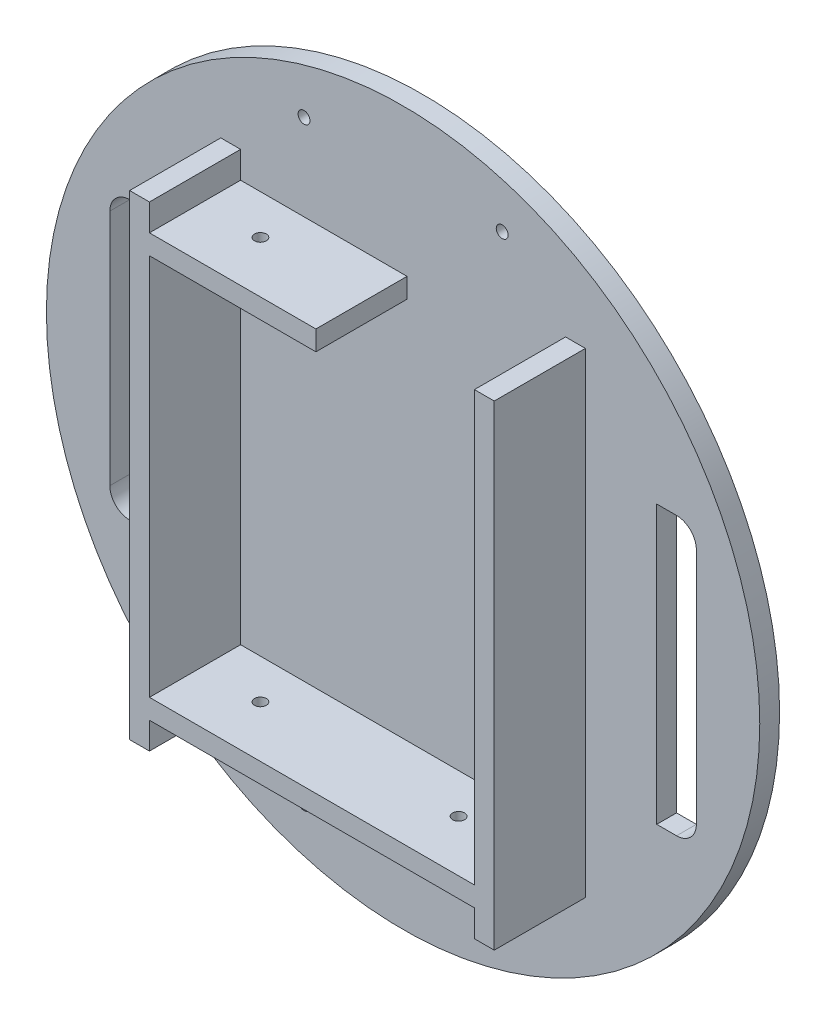
ISO-10303-21;
HEADER;
FILE_DESCRIPTION(('STEP AP214'),'2;1');
FILE_NAME('part.step','',(''),(''),'','','');
FILE_SCHEMA(('AUTOMOTIVE_DESIGN { 1 0 10303 214 1 1 1 1 }'));
ENDSEC;
DATA;
#1=APPLICATION_CONTEXT('core data for automotive mechanical design processes');
#2=APPLICATION_PROTOCOL_DEFINITION('international standard','automotive_design',2000,#1);
#3=PRODUCT_CONTEXT('',#1,'mechanical');
#4=PRODUCT('Part','Part','',(#3));
#5=PRODUCT_RELATED_PRODUCT_CATEGORY('part','',(#4));
#6=PRODUCT_DEFINITION_FORMATION('','',#4);
#7=PRODUCT_DEFINITION_CONTEXT('part definition',#1,'design');
#8=PRODUCT_DEFINITION('design','',#6,#7);
#9=PRODUCT_DEFINITION_SHAPE('','',#8);
#10=(LENGTH_UNIT() NAMED_UNIT(*) SI_UNIT(.MILLI.,.METRE.));
#11=(NAMED_UNIT(*) PLANE_ANGLE_UNIT() SI_UNIT($,.RADIAN.));
#12=(NAMED_UNIT(*) SI_UNIT($,.STERADIAN.) SOLID_ANGLE_UNIT());
#13=UNCERTAINTY_MEASURE_WITH_UNIT(LENGTH_MEASURE(1.E-05),#10,'distance_accuracy_value','');
#14=(GEOMETRIC_REPRESENTATION_CONTEXT(3) GLOBAL_UNCERTAINTY_ASSIGNED_CONTEXT((#13)) GLOBAL_UNIT_ASSIGNED_CONTEXT((#10,
#11,#12)) REPRESENTATION_CONTEXT('',''));
#15=CARTESIAN_POINT('',(0.,0.,0.));
#16=DIRECTION('',(0.,0.,1.));
#17=DIRECTION('',(1.,0.,0.));
#18=AXIS2_PLACEMENT_3D('',#15,#16,#17);
#19=CARTESIAN_POINT('',(0.,0.,5.));
#20=DIRECTION('',(0.,0.,1.));
#21=DIRECTION('',(1.,0.,0.));
#22=AXIS2_PLACEMENT_3D('',#19,#20,#21);
#23=PLANE('',#22);
#24=DIRECTION('',(0.,-1.,0.));
#25=VECTOR('',#24,1.);
#26=CARTESIAN_POINT('',(64.,35.,5.));
#27=LINE('',#26,#25);
#28=CARTESIAN_POINT('',(64.,35.,5.));
#29=VERTEX_POINT('',#28);
#30=CARTESIAN_POINT('',(64.,-35.,5.));
#31=VERTEX_POINT('',#30);
#32=EDGE_CURVE('E383',#29,#31,#27,.T.);
#33=ORIENTED_EDGE('',*,*,#32,.F.);
#34=DIRECTION('',(1.,0.,0.));
#35=VECTOR('',#34,1.);
#36=CARTESIAN_POINT('',(64.,35.,5.));
#37=LINE('',#36,#35);
#38=CARTESIAN_POINT('',(69.,35.,5.));
#39=VERTEX_POINT('',#38);
#40=EDGE_CURVE('E399',#29,#39,#37,.T.);
#41=ORIENTED_EDGE('',*,*,#40,.T.);
#42=CARTESIAN_POINT('',(69.,30.,5.));
#43=DIRECTION('',(0.,0.,-1.));
#44=DIRECTION('',(-1.,0.,0.));
#45=AXIS2_PLACEMENT_3D('',#42,#43,#44);
#46=CIRCLE('',#45,5.);
#47=CARTESIAN_POINT('',(74.,30.,5.));
#48=VERTEX_POINT('',#47);
#49=EDGE_CURVE('E396',#39,#48,#46,.T.);
#50=ORIENTED_EDGE('',*,*,#49,.T.);
#51=DIRECTION('',(0.,-1.,0.));
#52=VECTOR('',#51,1.);
#53=CARTESIAN_POINT('',(74.,30.,5.));
#54=LINE('',#53,#52);
#55=CARTESIAN_POINT('',(74.,-30.,5.));
#56=VERTEX_POINT('',#55);
#57=EDGE_CURVE('E393',#48,#56,#54,.T.);
#58=ORIENTED_EDGE('',*,*,#57,.T.);
#59=CARTESIAN_POINT('',(69.,-30.,5.));
#60=DIRECTION('',(0.,0.,1.));
#61=DIRECTION('',(1.,0.,0.));
#62=AXIS2_PLACEMENT_3D('',#59,#60,#61);
#63=CIRCLE('',#62,5.);
#64=CARTESIAN_POINT('',(69.,-35.,5.));
#65=VERTEX_POINT('',#64);
#66=EDGE_CURVE('E390',#65,#56,#63,.T.);
#67=ORIENTED_EDGE('',*,*,#66,.F.);
#68=DIRECTION('',(1.,0.,0.));
#69=VECTOR('',#68,1.);
#70=CARTESIAN_POINT('',(64.,-35.,5.));
#71=LINE('',#70,#69);
#72=EDGE_CURVE('E386',#31,#65,#71,.T.);
#73=ORIENTED_EDGE('',*,*,#72,.F.);
#74=EDGE_LOOP('',(#33,#41,#50,#58,#67,#73));
#75=FACE_BOUND('',#74,.T.);
#76=CARTESIAN_POINT('',(0.,0.,5.));
#77=DIRECTION('',(0.,0.,1.));
#78=DIRECTION('',(1.,0.,0.));
#79=AXIS2_PLACEMENT_3D('',#76,#77,#78);
#80=CIRCLE('',#79,90.);
#81=CARTESIAN_POINT('',(90.,0.,5.));
#82=VERTEX_POINT('',#81);
#83=EDGE_CURVE('E11',#82,#82,#80,.T.);
#84=ORIENTED_EDGE('',*,*,#83,.T.);
#85=EDGE_LOOP('',(#84));
#86=FACE_BOUND('',#85,.T.);
#87=DIRECTION('',(-1.,0.,0.));
#88=VECTOR('',#87,1.);
#89=CARTESIAN_POINT('',(0.,-35.,5.));
#90=LINE('',#89,#88);
#91=CARTESIAN_POINT('',(-64.,-35.,5.));
#92=VERTEX_POINT('',#91);
#93=CARTESIAN_POINT('',(-69.,-35.,5.));
#94=VERTEX_POINT('',#93);
#95=EDGE_CURVE('E436',#92,#94,#90,.T.);
#96=ORIENTED_EDGE('',*,*,#95,.T.);
#97=CARTESIAN_POINT('',(-69.,-30.,5.));
#98=DIRECTION('',(0.,0.,1.));
#99=DIRECTION('',(1.,0.,0.));
#100=AXIS2_PLACEMENT_3D('',#97,#98,#99);
#101=CIRCLE('',#100,5.);
#102=CARTESIAN_POINT('',(-74.,-30.,5.));
#103=VERTEX_POINT('',#102);
#104=EDGE_CURVE('E402',#94,#103,#101,.F.);
#105=ORIENTED_EDGE('',*,*,#104,.T.);
#106=DIRECTION('',(0.,-1.,0.));
#107=VECTOR('',#106,1.);
#108=CARTESIAN_POINT('',(-74.,0.,5.));
#109=LINE('',#108,#107);
#110=CARTESIAN_POINT('',(-74.,30.,5.));
#111=VERTEX_POINT('',#110);
#112=EDGE_CURVE('E419',#111,#103,#109,.T.);
#113=ORIENTED_EDGE('',*,*,#112,.F.);
#114=CARTESIAN_POINT('',(-69.,30.,5.));
#115=DIRECTION('',(0.,0.,1.));
#116=DIRECTION('',(1.,0.,0.));
#117=AXIS2_PLACEMENT_3D('',#114,#115,#116);
#118=CIRCLE('',#117,5.);
#119=CARTESIAN_POINT('',(-69.,35.,5.));
#120=VERTEX_POINT('',#119);
#121=EDGE_CURVE('E445',#120,#111,#118,.T.);
#122=ORIENTED_EDGE('',*,*,#121,.F.);
#123=DIRECTION('',(-1.,0.,0.));
#124=VECTOR('',#123,1.);
#125=CARTESIAN_POINT('',(0.,35.,5.));
#126=LINE('',#125,#124);
#127=CARTESIAN_POINT('',(-64.,35.,5.));
#128=VERTEX_POINT('',#127);
#129=EDGE_CURVE('E442',#128,#120,#126,.T.);
#130=ORIENTED_EDGE('',*,*,#129,.F.);
#131=DIRECTION('',(0.,-1.,0.));
#132=VECTOR('',#131,1.);
#133=CARTESIAN_POINT('',(-64.,0.,5.));
#134=LINE('',#133,#132);
#135=EDGE_CURVE('E439',#128,#92,#134,.T.);
#136=ORIENTED_EDGE('',*,*,#135,.T.);
#137=EDGE_LOOP('',(#96,#105,#113,#122,#130,#136));
#138=FACE_BOUND('',#137,.T.);
#139=CARTESIAN_POINT('',(-25.,75.,5.));
#140=DIRECTION('',(0.,0.,1.));
#141=DIRECTION('',(1.,0.,0.));
#142=AXIS2_PLACEMENT_3D('',#139,#140,#141);
#143=CIRCLE('',#142,1.5);
#144=CARTESIAN_POINT('',(-23.5,75.,5.));
#145=VERTEX_POINT('',#144);
#146=EDGE_CURVE('E360',#145,#145,#143,.T.);
#147=ORIENTED_EDGE('',*,*,#146,.F.);
#148=EDGE_LOOP('',(#147));
#149=FACE_BOUND('',#148,.T.);
#150=CARTESIAN_POINT('',(-25.,-75.,5.));
#151=DIRECTION('',(0.,0.,1.));
#152=DIRECTION('',(-1.,0.,0.));
#153=AXIS2_PLACEMENT_3D('',#150,#151,#152);
#154=CIRCLE('',#153,1.5);
#155=CARTESIAN_POINT('',(-26.5,-75.,5.));
#156=VERTEX_POINT('',#155);
#157=EDGE_CURVE('E354',#156,#156,#154,.T.);
#158=ORIENTED_EDGE('',*,*,#157,.F.);
#159=EDGE_LOOP('',(#158));
#160=FACE_BOUND('',#159,.T.);
#161=CARTESIAN_POINT('',(25.,75.,5.));
#162=DIRECTION('',(0.,0.,1.));
#163=DIRECTION('',(-1.,0.,0.));
#164=AXIS2_PLACEMENT_3D('',#161,#162,#163);
#165=CIRCLE('',#164,1.5);
#166=CARTESIAN_POINT('',(23.5,75.,5.));
#167=VERTEX_POINT('',#166);
#168=EDGE_CURVE('E348',#167,#167,#165,.T.);
#169=ORIENTED_EDGE('',*,*,#168,.F.);
#170=EDGE_LOOP('',(#169));
#171=FACE_BOUND('',#170,.T.);
#172=CARTESIAN_POINT('',(25.,-75.,5.));
#173=DIRECTION('',(0.,0.,1.));
#174=DIRECTION('',(1.,0.,0.));
#175=AXIS2_PLACEMENT_3D('',#172,#173,#174);
#176=CIRCLE('',#175,1.5);
#177=CARTESIAN_POINT('',(26.5,-75.,5.));
#178=VERTEX_POINT('',#177);
#179=EDGE_CURVE('E344',#178,#178,#176,.T.);
#180=ORIENTED_EDGE('',*,*,#179,.F.);
#181=EDGE_LOOP('',(#180));
#182=FACE_BOUND('',#181,.T.);
#183=DIRECTION('',(0.,1.,0.));
#184=VECTOR('',#183,1.);
#185=CARTESIAN_POINT('',(1.00000000000002,48.25,5.));
#186=LINE('',#185,#184);
#187=CARTESIAN_POINT('',(1.00000000000002,48.25,5.));
#188=VERTEX_POINT('',#187);
#189=CARTESIAN_POINT('',(1.00000000000002,53.25,5.));
#190=VERTEX_POINT('',#189);
#191=EDGE_CURVE('E52',#188,#190,#186,.T.);
#192=ORIENTED_EDGE('',*,*,#191,.F.);
#193=DIRECTION('',(1.,0.,0.));
#194=VECTOR('',#193,1.);
#195=CARTESIAN_POINT('',(-41.,48.25,5.));
#196=LINE('',#195,#194);
#197=CARTESIAN_POINT('',(-41.,48.25,5.));
#198=VERTEX_POINT('',#197);
#199=EDGE_CURVE('E248',#198,#188,#196,.T.);
#200=ORIENTED_EDGE('',*,*,#199,.F.);
#201=DIRECTION('',(0.,-1.,0.));
#202=VECTOR('',#201,1.);
#203=CARTESIAN_POINT('',(-41.,0.,5.));
#204=LINE('',#203,#202);
#205=CARTESIAN_POINT('',(-41.,-48.25,5.));
#206=VERTEX_POINT('',#205);
#207=EDGE_CURVE('E332',#198,#206,#204,.T.);
#208=ORIENTED_EDGE('',*,*,#207,.T.);
#209=DIRECTION('',(-1.,0.,0.));
#210=VECTOR('',#209,1.);
#211=CARTESIAN_POINT('',(-41.,-48.25,5.));
#212=LINE('',#211,#210);
#213=CARTESIAN_POINT('',(41.,-48.25,5.));
#214=VERTEX_POINT('',#213);
#215=EDGE_CURVE('E258',#214,#206,#212,.T.);
#216=ORIENTED_EDGE('',*,*,#215,.F.);
#217=DIRECTION('',(0.,-1.,0.));
#218=VECTOR('',#217,1.);
#219=CARTESIAN_POINT('',(41.,0.,5.));
#220=LINE('',#219,#218);
#221=CARTESIAN_POINT('',(41.,60.,5.));
#222=VERTEX_POINT('',#221);
#223=EDGE_CURVE('E291',#222,#214,#220,.T.);
#224=ORIENTED_EDGE('',*,*,#223,.F.);
#225=DIRECTION('',(1.,0.,0.));
#226=VECTOR('',#225,1.);
#227=CARTESIAN_POINT('',(0.,60.,5.));
#228=LINE('',#227,#226);
#229=CARTESIAN_POINT('',(46.,60.,5.));
#230=VERTEX_POINT('',#229);
#231=EDGE_CURVE('E268',#222,#230,#228,.T.);
#232=ORIENTED_EDGE('',*,*,#231,.T.);
#233=DIRECTION('',(0.,-1.,0.));
#234=VECTOR('',#233,1.);
#235=CARTESIAN_POINT('',(46.,0.,5.));
#236=LINE('',#235,#234);
#237=CARTESIAN_POINT('',(46.,-60.,5.));
#238=VERTEX_POINT('',#237);
#239=EDGE_CURVE('E279',#230,#238,#236,.T.);
#240=ORIENTED_EDGE('',*,*,#239,.T.);
#241=DIRECTION('',(1.,0.,0.));
#242=VECTOR('',#241,1.);
#243=CARTESIAN_POINT('',(0.,-60.,5.));
#244=LINE('',#243,#242);
#245=CARTESIAN_POINT('',(41.,-60.,5.));
#246=VERTEX_POINT('',#245);
#247=EDGE_CURVE('E294',#246,#238,#244,.T.);
#248=ORIENTED_EDGE('',*,*,#247,.F.);
#249=CARTESIAN_POINT('',(41.,-53.25,5.));
#250=VERTEX_POINT('',#249);
#251=EDGE_CURVE('E290',#250,#246,#220,.T.);
#252=ORIENTED_EDGE('',*,*,#251,.F.);
#253=DIRECTION('',(1.,0.,0.));
#254=VECTOR('',#253,1.);
#255=CARTESIAN_POINT('',(-41.,-53.25,5.));
#256=LINE('',#255,#254);
#257=CARTESIAN_POINT('',(-41.,-53.25,5.));
#258=VERTEX_POINT('',#257);
#259=EDGE_CURVE('E263',#258,#250,#256,.T.);
#260=ORIENTED_EDGE('',*,*,#259,.F.);
#261=CARTESIAN_POINT('',(-41.,-60.,5.));
#262=VERTEX_POINT('',#261);
#263=EDGE_CURVE('E330',#258,#262,#204,.T.);
#264=ORIENTED_EDGE('',*,*,#263,.T.);
#265=DIRECTION('',(-1.,0.,0.));
#266=VECTOR('',#265,1.);
#267=CARTESIAN_POINT('',(0.,-60.,5.));
#268=LINE('',#267,#266);
#269=CARTESIAN_POINT('',(-46.,-60.,5.));
#270=VERTEX_POINT('',#269);
#271=EDGE_CURVE('E328',#262,#270,#268,.T.);
#272=ORIENTED_EDGE('',*,*,#271,.T.);
#273=DIRECTION('',(0.,-1.,0.));
#274=VECTOR('',#273,1.);
#275=CARTESIAN_POINT('',(-46.,0.,5.));
#276=LINE('',#275,#274);
#277=CARTESIAN_POINT('',(-46.,60.,5.));
#278=VERTEX_POINT('',#277);
#279=EDGE_CURVE('E325',#278,#270,#276,.T.);
#280=ORIENTED_EDGE('',*,*,#279,.F.);
#281=DIRECTION('',(-1.,0.,0.));
#282=VECTOR('',#281,1.);
#283=CARTESIAN_POINT('',(0.,60.,5.));
#284=LINE('',#283,#282);
#285=CARTESIAN_POINT('',(-41.,60.,5.));
#286=VERTEX_POINT('',#285);
#287=EDGE_CURVE('E309',#286,#278,#284,.T.);
#288=ORIENTED_EDGE('',*,*,#287,.F.);
#289=CARTESIAN_POINT('',(-41.,53.25,5.));
#290=VERTEX_POINT('',#289);
#291=EDGE_CURVE('E313',#286,#290,#204,.T.);
#292=ORIENTED_EDGE('',*,*,#291,.T.);
#293=DIRECTION('',(-1.,0.,0.));
#294=VECTOR('',#293,1.);
#295=CARTESIAN_POINT('',(-41.,53.25,5.));
#296=LINE('',#295,#294);
#297=EDGE_CURVE('E57',#190,#290,#296,.T.);
#298=ORIENTED_EDGE('',*,*,#297,.F.);
#299=EDGE_LOOP('',(#192,#200,#208,#216,#224,#232,#240,#248,#252,#260,#264,#272,#280,#288,#292,#298));
#300=FACE_BOUND('',#299,.T.);
#301=ADVANCED_FACE('F35',(#75,#86,#138,#149,#160,#171,#182,#300),#23,.T.);
#302=CARTESIAN_POINT('',(-41.,0.,28.));
#303=DIRECTION('',(1.,0.,0.));
#304=DIRECTION('',(0.,1.,0.));
#305=AXIS2_PLACEMENT_3D('',#302,#303,#304);
#306=PLANE('',#305);
#307=ORIENTED_EDGE('',*,*,#207,.F.);
#308=DIRECTION('',(0.,0.,-1.));
#309=VECTOR('',#308,1.);
#310=CARTESIAN_POINT('',(-41.,48.25,110.152297594164));
#311=LINE('',#310,#309);
#312=CARTESIAN_POINT('',(-41.,48.25,28.));
#313=VERTEX_POINT('',#312);
#314=EDGE_CURVE('E251',#313,#198,#311,.T.);
#315=ORIENTED_EDGE('',*,*,#314,.F.);
#316=DIRECTION('',(0.,-1.,0.));
#317=VECTOR('',#316,1.);
#318=CARTESIAN_POINT('',(-41.,0.,28.));
#319=LINE('',#318,#317);
#320=CARTESIAN_POINT('',(-41.,-48.25,28.));
#321=VERTEX_POINT('',#320);
#322=EDGE_CURVE('E322',#313,#321,#319,.T.);
#323=ORIENTED_EDGE('',*,*,#322,.T.);
#324=DIRECTION('',(0.,0.,-1.));
#325=VECTOR('',#324,1.);
#326=CARTESIAN_POINT('',(-41.,-48.25,110.152297594164));
#327=LINE('',#326,#325);
#328=EDGE_CURVE('E241',#321,#206,#327,.T.);
#329=ORIENTED_EDGE('',*,*,#328,.T.);
#330=EDGE_LOOP('',(#307,#315,#323,#329));
#331=FACE_BOUND('',#330,.T.);
#332=ADVANCED_FACE('F500',(#331),#306,.T.);
#333=CARTESIAN_POINT('',(-41.,60.,28.));
#334=VERTEX_POINT('',#333);
#335=CARTESIAN_POINT('',(-41.,53.25,28.));
#336=VERTEX_POINT('',#335);
#337=EDGE_CURVE('E319',#334,#336,#319,.T.);
#338=ORIENTED_EDGE('',*,*,#337,.T.);
#339=DIRECTION('',(0.,0.,-1.));
#340=VECTOR('',#339,1.);
#341=CARTESIAN_POINT('',(-41.,53.25,110.152297594164));
#342=LINE('',#341,#340);
#343=EDGE_CURVE('E232',#336,#290,#342,.T.);
#344=ORIENTED_EDGE('',*,*,#343,.T.);
#345=ORIENTED_EDGE('',*,*,#291,.F.);
#346=DIRECTION('',(0.,0.,-1.));
#347=VECTOR('',#346,1.);
#348=CARTESIAN_POINT('',(-41.,60.,28.));
#349=LINE('',#348,#347);
#350=EDGE_CURVE('E321',#334,#286,#349,.T.);
#351=ORIENTED_EDGE('',*,*,#350,.F.);
#352=EDGE_LOOP('',(#338,#344,#345,#351));
#353=FACE_BOUND('',#352,.T.);
#354=ADVANCED_FACE('F506',(#353),#306,.T.);
#355=ORIENTED_EDGE('',*,*,#263,.F.);
#356=DIRECTION('',(0.,0.,-1.));
#357=VECTOR('',#356,1.);
#358=CARTESIAN_POINT('',(-41.,-53.25,110.152297594164));
#359=LINE('',#358,#357);
#360=CARTESIAN_POINT('',(-41.,-53.25,28.));
#361=VERTEX_POINT('',#360);
#362=EDGE_CURVE('E244',#361,#258,#359,.T.);
#363=ORIENTED_EDGE('',*,*,#362,.F.);
#364=CARTESIAN_POINT('',(-41.,-60.,28.));
#365=VERTEX_POINT('',#364);
#366=EDGE_CURVE('E318',#361,#365,#319,.T.);
#367=ORIENTED_EDGE('',*,*,#366,.T.);
#368=DIRECTION('',(0.,0.,-1.));
#369=VECTOR('',#368,1.);
#370=CARTESIAN_POINT('',(-41.,-60.,28.));
#371=LINE('',#370,#369);
#372=EDGE_CURVE('E335',#365,#262,#371,.T.);
#373=ORIENTED_EDGE('',*,*,#372,.T.);
#374=EDGE_LOOP('',(#355,#363,#367,#373));
#375=FACE_BOUND('',#374,.T.);
#376=ADVANCED_FACE('F509',(#375),#306,.T.);
#377=CARTESIAN_POINT('',(41.,0.,28.));
#378=DIRECTION('',(1.,0.,0.));
#379=DIRECTION('',(0.,1.,0.));
#380=AXIS2_PLACEMENT_3D('',#377,#378,#379);
#381=PLANE('',#380);
#382=DIRECTION('',(0.,0.,-1.));
#383=VECTOR('',#382,1.);
#384=CARTESIAN_POINT('',(41.,-53.25,110.152297594164));
#385=LINE('',#384,#383);
#386=CARTESIAN_POINT('',(41.,-53.25,28.));
#387=VERTEX_POINT('',#386);
#388=EDGE_CURVE('E265',#387,#250,#385,.T.);
#389=ORIENTED_EDGE('',*,*,#388,.T.);
#390=ORIENTED_EDGE('',*,*,#251,.T.);
#391=DIRECTION('',(0.,0.,-1.));
#392=VECTOR('',#391,1.);
#393=CARTESIAN_POINT('',(41.,-60.,28.));
#394=LINE('',#393,#392);
#395=CARTESIAN_POINT('',(41.,-60.,28.));
#396=VERTEX_POINT('',#395);
#397=EDGE_CURVE('E303',#396,#246,#394,.T.);
#398=ORIENTED_EDGE('',*,*,#397,.F.);
#399=DIRECTION('',(0.,-1.,0.));
#400=VECTOR('',#399,1.);
#401=CARTESIAN_POINT('',(41.,0.,28.));
#402=LINE('',#401,#400);
#403=EDGE_CURVE('E278',#387,#396,#402,.T.);
#404=ORIENTED_EDGE('',*,*,#403,.F.);
#405=EDGE_LOOP('',(#389,#390,#398,#404));
#406=FACE_BOUND('',#405,.T.);
#407=ADVANCED_FACE('F524',(#406),#381,.F.);
#408=DIRECTION('',(0.,0.,-1.));
#409=VECTOR('',#408,1.);
#410=CARTESIAN_POINT('',(41.,-48.25,110.152297594164));
#411=LINE('',#410,#409);
#412=CARTESIAN_POINT('',(41.,-48.25,28.));
#413=VERTEX_POINT('',#412);
#414=EDGE_CURVE('E262',#413,#214,#411,.T.);
#415=ORIENTED_EDGE('',*,*,#414,.F.);
#416=CARTESIAN_POINT('',(41.,60.,28.));
#417=VERTEX_POINT('',#416);
#418=EDGE_CURVE('E280',#417,#413,#402,.T.);
#419=ORIENTED_EDGE('',*,*,#418,.F.);
#420=DIRECTION('',(0.,0.,-1.));
#421=VECTOR('',#420,1.);
#422=CARTESIAN_POINT('',(41.,60.,28.));
#423=LINE('',#422,#421);
#424=EDGE_CURVE('E306',#417,#222,#423,.T.);
#425=ORIENTED_EDGE('',*,*,#424,.T.);
#426=ORIENTED_EDGE('',*,*,#223,.T.);
#427=EDGE_LOOP('',(#415,#419,#425,#426));
#428=FACE_BOUND('',#427,.T.);
#429=ADVANCED_FACE('F517',(#428),#381,.F.);
#430=CARTESIAN_POINT('',(0.,0.,0.));
#431=DIRECTION('',(0.,0.,1.));
#432=DIRECTION('',(1.,0.,0.));
#433=AXIS2_PLACEMENT_3D('',#430,#431,#432);
#434=PLANE('',#433);
#435=CARTESIAN_POINT('',(25.,-75.,0.));
#436=DIRECTION('',(0.,0.,1.));
#437=DIRECTION('',(1.,0.,0.));
#438=AXIS2_PLACEMENT_3D('',#435,#436,#437);
#439=CIRCLE('',#438,1.5);
#440=CARTESIAN_POINT('',(26.5,-75.,0.));
#441=VERTEX_POINT('',#440);
#442=EDGE_CURVE('E345',#441,#441,#439,.T.);
#443=ORIENTED_EDGE('',*,*,#442,.T.);
#444=EDGE_LOOP('',(#443));
#445=FACE_BOUND('',#444,.T.);
#446=CARTESIAN_POINT('',(25.,75.,0.));
#447=DIRECTION('',(0.,0.,1.));
#448=DIRECTION('',(-1.,0.,0.));
#449=AXIS2_PLACEMENT_3D('',#446,#447,#448);
#450=CIRCLE('',#449,1.5);
#451=CARTESIAN_POINT('',(23.5,75.,0.));
#452=VERTEX_POINT('',#451);
#453=EDGE_CURVE('E351',#452,#452,#450,.T.);
#454=ORIENTED_EDGE('',*,*,#453,.T.);
#455=EDGE_LOOP('',(#454));
#456=FACE_BOUND('',#455,.T.);
#457=CARTESIAN_POINT('',(-25.,-75.,0.));
#458=DIRECTION('',(0.,0.,1.));
#459=DIRECTION('',(-1.,0.,0.));
#460=AXIS2_PLACEMENT_3D('',#457,#458,#459);
#461=CIRCLE('',#460,1.5);
#462=CARTESIAN_POINT('',(-26.5,-75.,0.));
#463=VERTEX_POINT('',#462);
#464=EDGE_CURVE('E357',#463,#463,#461,.T.);
#465=ORIENTED_EDGE('',*,*,#464,.T.);
#466=EDGE_LOOP('',(#465));
#467=FACE_BOUND('',#466,.T.);
#468=CARTESIAN_POINT('',(-25.,75.,0.));
#469=DIRECTION('',(0.,0.,1.));
#470=DIRECTION('',(1.,0.,0.));
#471=AXIS2_PLACEMENT_3D('',#468,#469,#470);
#472=CIRCLE('',#471,1.5);
#473=CARTESIAN_POINT('',(-23.5,75.,0.));
#474=VERTEX_POINT('',#473);
#475=EDGE_CURVE('E363',#474,#474,#472,.T.);
#476=ORIENTED_EDGE('',*,*,#475,.T.);
#477=EDGE_LOOP('',(#476));
#478=FACE_BOUND('',#477,.T.);
#479=CARTESIAN_POINT('',(-69.,-30.,0.));
#480=DIRECTION('',(0.,0.,1.));
#481=DIRECTION('',(1.,0.,0.));
#482=AXIS2_PLACEMENT_3D('',#479,#480,#481);
#483=CIRCLE('',#482,5.);
#484=CARTESIAN_POINT('',(-69.,-35.,0.));
#485=VERTEX_POINT('',#484);
#486=CARTESIAN_POINT('',(-74.,-30.,0.));
#487=VERTEX_POINT('',#486);
#488=EDGE_CURVE('E416',#485,#487,#483,.F.);
#489=ORIENTED_EDGE('',*,*,#488,.F.);
#490=DIRECTION('',(-1.,0.,0.));
#491=VECTOR('',#490,1.);
#492=CARTESIAN_POINT('',(0.,-35.,0.));
#493=LINE('',#492,#491);
#494=CARTESIAN_POINT('',(-64.,-35.,0.));
#495=VERTEX_POINT('',#494);
#496=EDGE_CURVE('E418',#495,#485,#493,.T.);
#497=ORIENTED_EDGE('',*,*,#496,.F.);
#498=DIRECTION('',(0.,-1.,0.));
#499=VECTOR('',#498,1.);
#500=CARTESIAN_POINT('',(-64.,0.,0.));
#501=LINE('',#500,#499);
#502=CARTESIAN_POINT('',(-64.,35.,0.));
#503=VERTEX_POINT('',#502);
#504=EDGE_CURVE('E421',#503,#495,#501,.T.);
#505=ORIENTED_EDGE('',*,*,#504,.F.);
#506=DIRECTION('',(-1.,0.,0.));
#507=VECTOR('',#506,1.);
#508=CARTESIAN_POINT('',(0.,35.,0.));
#509=LINE('',#508,#507);
#510=CARTESIAN_POINT('',(-69.,35.,0.));
#511=VERTEX_POINT('',#510);
#512=EDGE_CURVE('E424',#503,#511,#509,.T.);
#513=ORIENTED_EDGE('',*,*,#512,.T.);
#514=CARTESIAN_POINT('',(-69.,30.,0.));
#515=DIRECTION('',(0.,0.,1.));
#516=DIRECTION('',(1.,0.,0.));
#517=AXIS2_PLACEMENT_3D('',#514,#515,#516);
#518=CIRCLE('',#517,5.);
#519=CARTESIAN_POINT('',(-74.,30.,0.));
#520=VERTEX_POINT('',#519);
#521=EDGE_CURVE('E427',#511,#520,#518,.T.);
#522=ORIENTED_EDGE('',*,*,#521,.T.);
#523=DIRECTION('',(0.,-1.,0.));
#524=VECTOR('',#523,1.);
#525=CARTESIAN_POINT('',(-74.,0.,0.));
#526=LINE('',#525,#524);
#527=EDGE_CURVE('E430',#520,#487,#526,.T.);
#528=ORIENTED_EDGE('',*,*,#527,.T.);
#529=EDGE_LOOP('',(#489,#497,#505,#513,#522,#528));
#530=FACE_BOUND('',#529,.T.);
#531=CARTESIAN_POINT('',(0.,0.,0.));
#532=DIRECTION('',(0.,0.,1.));
#533=DIRECTION('',(1.,0.,0.));
#534=AXIS2_PLACEMENT_3D('',#531,#532,#533);
#535=CIRCLE('',#534,90.);
#536=CARTESIAN_POINT('',(90.,0.,0.));
#537=VERTEX_POINT('',#536);
#538=EDGE_CURVE('E44',#537,#537,#535,.T.);
#539=ORIENTED_EDGE('',*,*,#538,.F.);
#540=EDGE_LOOP('',(#539));
#541=FACE_BOUND('',#540,.T.);
#542=DIRECTION('',(1.,0.,0.));
#543=VECTOR('',#542,1.);
#544=CARTESIAN_POINT('',(64.,35.,0.));
#545=LINE('',#544,#543);
#546=CARTESIAN_POINT('',(64.,35.,0.));
#547=VERTEX_POINT('',#546);
#548=CARTESIAN_POINT('',(69.,35.,0.));
#549=VERTEX_POINT('',#548);
#550=EDGE_CURVE('E387',#547,#549,#545,.T.);
#551=ORIENTED_EDGE('',*,*,#550,.F.);
#552=DIRECTION('',(0.,-1.,0.));
#553=VECTOR('',#552,1.);
#554=CARTESIAN_POINT('',(64.,35.,0.));
#555=LINE('',#554,#553);
#556=CARTESIAN_POINT('',(64.,-35.,0.));
#557=VERTEX_POINT('',#556);
#558=EDGE_CURVE('E382',#547,#557,#555,.T.);
#559=ORIENTED_EDGE('',*,*,#558,.T.);
#560=DIRECTION('',(1.,0.,0.));
#561=VECTOR('',#560,1.);
#562=CARTESIAN_POINT('',(64.,-35.,0.));
#563=LINE('',#562,#561);
#564=CARTESIAN_POINT('',(69.,-35.,0.));
#565=VERTEX_POINT('',#564);
#566=EDGE_CURVE('E405',#557,#565,#563,.T.);
#567=ORIENTED_EDGE('',*,*,#566,.T.);
#568=CARTESIAN_POINT('',(69.,-30.,0.));
#569=DIRECTION('',(0.,0.,1.));
#570=DIRECTION('',(1.,0.,0.));
#571=AXIS2_PLACEMENT_3D('',#568,#569,#570);
#572=CIRCLE('',#571,5.);
#573=CARTESIAN_POINT('',(74.,-30.,0.));
#574=VERTEX_POINT('',#573);
#575=EDGE_CURVE('E408',#565,#574,#572,.T.);
#576=ORIENTED_EDGE('',*,*,#575,.T.);
#577=DIRECTION('',(0.,-1.,0.));
#578=VECTOR('',#577,1.);
#579=CARTESIAN_POINT('',(74.,30.,0.));
#580=LINE('',#579,#578);
#581=CARTESIAN_POINT('',(74.,30.,0.));
#582=VERTEX_POINT('',#581);
#583=EDGE_CURVE('E411',#582,#574,#580,.T.);
#584=ORIENTED_EDGE('',*,*,#583,.F.);
#585=CARTESIAN_POINT('',(69.,30.,0.));
#586=DIRECTION('',(0.,0.,-1.));
#587=DIRECTION('',(-1.,0.,0.));
#588=AXIS2_PLACEMENT_3D('',#585,#586,#587);
#589=CIRCLE('',#588,5.);
#590=EDGE_CURVE('E413',#549,#582,#589,.T.);
#591=ORIENTED_EDGE('',*,*,#590,.F.);
#592=EDGE_LOOP('',(#551,#559,#567,#576,#584,#591));
#593=FACE_BOUND('',#592,.T.);
#594=ADVANCED_FACE('F515',(#445,#456,#467,#478,#530,#541,#593),#434,.F.);
#595=CARTESIAN_POINT('',(0.,0.,5.));
#596=DIRECTION('',(0.,0.,-1.));
#597=DIRECTION('',(-1.,0.,0.));
#598=AXIS2_PLACEMENT_3D('',#595,#596,#597);
#599=CYLINDRICAL_SURFACE('',#598,90.);
#600=ORIENTED_EDGE('',*,*,#83,.F.);
#601=EDGE_LOOP('',(#600));
#602=FACE_BOUND('',#601,.T.);
#603=ORIENTED_EDGE('',*,*,#538,.T.);
#604=EDGE_LOOP('',(#603));
#605=FACE_BOUND('',#604,.T.);
#606=ADVANCED_FACE('F37',(#602,#605),#599,.T.);
#607=CARTESIAN_POINT('',(-69.,-30.,0.));
#608=DIRECTION('',(0.,0.,1.));
#609=DIRECTION('',(1.,0.,0.));
#610=AXIS2_PLACEMENT_3D('',#607,#608,#609);
#611=CYLINDRICAL_SURFACE('',#610,5.);
#612=ORIENTED_EDGE('',*,*,#104,.F.);
#613=DIRECTION('',(0.,0.,1.));
#614=VECTOR('',#613,1.);
#615=CARTESIAN_POINT('',(-69.,-35.,0.));
#616=LINE('',#615,#614);
#617=EDGE_CURVE('E433',#485,#94,#616,.T.);
#618=ORIENTED_EDGE('',*,*,#617,.F.);
#619=ORIENTED_EDGE('',*,*,#488,.T.);
#620=DIRECTION('',(0.,0.,1.));
#621=VECTOR('',#620,1.);
#622=CARTESIAN_POINT('',(-74.,-30.,0.));
#623=LINE('',#622,#621);
#624=EDGE_CURVE('E450',#487,#103,#623,.T.);
#625=ORIENTED_EDGE('',*,*,#624,.T.);
#626=EDGE_LOOP('',(#612,#618,#619,#625));
#627=FACE_BOUND('',#626,.T.);
#628=ADVANCED_FACE('F513',(#627),#611,.F.);
#629=CARTESIAN_POINT('',(-74.,0.,0.));
#630=DIRECTION('',(-1.,0.,0.));
#631=DIRECTION('',(0.,-1.,0.));
#632=AXIS2_PLACEMENT_3D('',#629,#630,#631);
#633=PLANE('',#632);
#634=ORIENTED_EDGE('',*,*,#112,.T.);
#635=ORIENTED_EDGE('',*,*,#624,.F.);
#636=ORIENTED_EDGE('',*,*,#527,.F.);
#637=DIRECTION('',(0.,0.,1.));
#638=VECTOR('',#637,1.);
#639=CARTESIAN_POINT('',(-74.,30.,0.));
#640=LINE('',#639,#638);
#641=EDGE_CURVE('E452',#520,#111,#640,.T.);
#642=ORIENTED_EDGE('',*,*,#641,.T.);
#643=EDGE_LOOP('',(#634,#635,#636,#642));
#644=FACE_BOUND('',#643,.T.);
#645=ADVANCED_FACE('F579',(#644),#633,.F.);
#646=CARTESIAN_POINT('',(-69.,30.,0.));
#647=DIRECTION('',(0.,0.,1.));
#648=DIRECTION('',(1.,0.,0.));
#649=AXIS2_PLACEMENT_3D('',#646,#647,#648);
#650=CYLINDRICAL_SURFACE('',#649,5.);
#651=ORIENTED_EDGE('',*,*,#121,.T.);
#652=ORIENTED_EDGE('',*,*,#641,.F.);
#653=ORIENTED_EDGE('',*,*,#521,.F.);
#654=DIRECTION('',(0.,0.,1.));
#655=VECTOR('',#654,1.);
#656=CARTESIAN_POINT('',(-69.,35.,0.));
#657=LINE('',#656,#655);
#658=EDGE_CURVE('E454',#511,#120,#657,.T.);
#659=ORIENTED_EDGE('',*,*,#658,.T.);
#660=EDGE_LOOP('',(#651,#652,#653,#659));
#661=FACE_BOUND('',#660,.T.);
#662=ADVANCED_FACE('F582',(#661),#650,.F.);
#663=CARTESIAN_POINT('',(0.,35.,0.));
#664=DIRECTION('',(0.,1.,0.));
#665=DIRECTION('',(0.,0.,1.));
#666=AXIS2_PLACEMENT_3D('',#663,#664,#665);
#667=PLANE('',#666);
#668=ORIENTED_EDGE('',*,*,#129,.T.);
#669=ORIENTED_EDGE('',*,*,#658,.F.);
#670=ORIENTED_EDGE('',*,*,#512,.F.);
#671=DIRECTION('',(0.,0.,1.));
#672=VECTOR('',#671,1.);
#673=CARTESIAN_POINT('',(-64.,35.,0.));
#674=LINE('',#673,#672);
#675=EDGE_CURVE('E456',#503,#128,#674,.T.);
#676=ORIENTED_EDGE('',*,*,#675,.T.);
#677=EDGE_LOOP('',(#668,#669,#670,#676));
#678=FACE_BOUND('',#677,.T.);
#679=ADVANCED_FACE('F586',(#678),#667,.F.);
#680=CARTESIAN_POINT('',(-64.,0.,0.));
#681=DIRECTION('',(-1.,0.,0.));
#682=DIRECTION('',(0.,-1.,0.));
#683=AXIS2_PLACEMENT_3D('',#680,#681,#682);
#684=PLANE('',#683);
#685=ORIENTED_EDGE('',*,*,#135,.F.);
#686=ORIENTED_EDGE('',*,*,#675,.F.);
#687=ORIENTED_EDGE('',*,*,#504,.T.);
#688=DIRECTION('',(0.,0.,1.));
#689=VECTOR('',#688,1.);
#690=CARTESIAN_POINT('',(-64.,-35.,0.));
#691=LINE('',#690,#689);
#692=EDGE_CURVE('E458',#495,#92,#691,.T.);
#693=ORIENTED_EDGE('',*,*,#692,.T.);
#694=EDGE_LOOP('',(#685,#686,#687,#693));
#695=FACE_BOUND('',#694,.T.);
#696=ADVANCED_FACE('F590',(#695),#684,.T.);
#697=CARTESIAN_POINT('',(0.,-35.,0.));
#698=DIRECTION('',(0.,1.,0.));
#699=DIRECTION('',(0.,0.,1.));
#700=AXIS2_PLACEMENT_3D('',#697,#698,#699);
#701=PLANE('',#700);
#702=ORIENTED_EDGE('',*,*,#95,.F.);
#703=ORIENTED_EDGE('',*,*,#692,.F.);
#704=ORIENTED_EDGE('',*,*,#496,.T.);
#705=ORIENTED_EDGE('',*,*,#617,.T.);
#706=EDGE_LOOP('',(#702,#703,#704,#705));
#707=FACE_BOUND('',#706,.T.);
#708=ADVANCED_FACE('F593',(#707),#701,.T.);
#709=CARTESIAN_POINT('',(64.,35.,0.));
#710=DIRECTION('',(0.,-1.,0.));
#711=DIRECTION('',(0.,0.,-1.));
#712=AXIS2_PLACEMENT_3D('',#709,#710,#711);
#713=PLANE('',#712);
#714=ORIENTED_EDGE('',*,*,#40,.F.);
#715=DIRECTION('',(0.,0.,1.));
#716=VECTOR('',#715,1.);
#717=CARTESIAN_POINT('',(64.,35.,0.));
#718=LINE('',#717,#716);
#719=EDGE_CURVE('E379',#547,#29,#718,.T.);
#720=ORIENTED_EDGE('',*,*,#719,.F.);
#721=ORIENTED_EDGE('',*,*,#550,.T.);
#722=DIRECTION('',(0.,0.,1.));
#723=VECTOR('',#722,1.);
#724=CARTESIAN_POINT('',(69.,35.,0.));
#725=LINE('',#724,#723);
#726=EDGE_CURVE('E366',#549,#39,#725,.T.);
#727=ORIENTED_EDGE('',*,*,#726,.T.);
#728=EDGE_LOOP('',(#714,#720,#721,#727));
#729=FACE_BOUND('',#728,.T.);
#730=ADVANCED_FACE('F546',(#729),#713,.T.);
#731=CARTESIAN_POINT('',(69.,30.,0.));
#732=DIRECTION('',(0.,0.,1.));
#733=DIRECTION('',(1.,0.,0.));
#734=AXIS2_PLACEMENT_3D('',#731,#732,#733);
#735=CYLINDRICAL_SURFACE('',#734,5.);
#736=ORIENTED_EDGE('',*,*,#49,.F.);
#737=ORIENTED_EDGE('',*,*,#726,.F.);
#738=ORIENTED_EDGE('',*,*,#590,.T.);
#739=DIRECTION('',(0.,0.,1.));
#740=VECTOR('',#739,1.);
#741=CARTESIAN_POINT('',(74.,30.,0.));
#742=LINE('',#741,#740);
#743=EDGE_CURVE('E371',#582,#48,#742,.T.);
#744=ORIENTED_EDGE('',*,*,#743,.T.);
#745=EDGE_LOOP('',(#736,#737,#738,#744));
#746=FACE_BOUND('',#745,.T.);
#747=ADVANCED_FACE('F548',(#746),#735,.F.);
#748=CARTESIAN_POINT('',(74.,30.,0.));
#749=DIRECTION('',(-1.,0.,0.));
#750=DIRECTION('',(0.,-1.,0.));
#751=AXIS2_PLACEMENT_3D('',#748,#749,#750);
#752=PLANE('',#751);
#753=ORIENTED_EDGE('',*,*,#57,.F.);
#754=ORIENTED_EDGE('',*,*,#743,.F.);
#755=ORIENTED_EDGE('',*,*,#583,.T.);
#756=DIRECTION('',(0.,0.,1.));
#757=VECTOR('',#756,1.);
#758=CARTESIAN_POINT('',(74.,-30.,0.));
#759=LINE('',#758,#757);
#760=EDGE_CURVE('E373',#574,#56,#759,.T.);
#761=ORIENTED_EDGE('',*,*,#760,.T.);
#762=EDGE_LOOP('',(#753,#754,#755,#761));
#763=FACE_BOUND('',#762,.T.);
#764=ADVANCED_FACE('F563',(#763),#752,.T.);
#765=CARTESIAN_POINT('',(69.,-30.,0.));
#766=DIRECTION('',(0.,0.,1.));
#767=DIRECTION('',(1.,0.,0.));
#768=AXIS2_PLACEMENT_3D('',#765,#766,#767);
#769=CYLINDRICAL_SURFACE('',#768,5.);
#770=ORIENTED_EDGE('',*,*,#66,.T.);
#771=ORIENTED_EDGE('',*,*,#760,.F.);
#772=ORIENTED_EDGE('',*,*,#575,.F.);
#773=DIRECTION('',(0.,0.,1.));
#774=VECTOR('',#773,1.);
#775=CARTESIAN_POINT('',(69.,-35.,0.));
#776=LINE('',#775,#774);
#777=EDGE_CURVE('E375',#565,#65,#776,.T.);
#778=ORIENTED_EDGE('',*,*,#777,.T.);
#779=EDGE_LOOP('',(#770,#771,#772,#778));
#780=FACE_BOUND('',#779,.T.);
#781=ADVANCED_FACE('F561',(#780),#769,.F.);
#782=CARTESIAN_POINT('',(64.,-35.,0.));
#783=DIRECTION('',(0.,-1.,0.));
#784=DIRECTION('',(0.,0.,-1.));
#785=AXIS2_PLACEMENT_3D('',#782,#783,#784);
#786=PLANE('',#785);
#787=ORIENTED_EDGE('',*,*,#72,.T.);
#788=ORIENTED_EDGE('',*,*,#777,.F.);
#789=ORIENTED_EDGE('',*,*,#566,.F.);
#790=DIRECTION('',(0.,0.,1.));
#791=VECTOR('',#790,1.);
#792=CARTESIAN_POINT('',(64.,-35.,0.));
#793=LINE('',#792,#791);
#794=EDGE_CURVE('E377',#557,#31,#793,.T.);
#795=ORIENTED_EDGE('',*,*,#794,.T.);
#796=EDGE_LOOP('',(#787,#788,#789,#795));
#797=FACE_BOUND('',#796,.T.);
#798=ADVANCED_FACE('F557',(#797),#786,.F.);
#799=CARTESIAN_POINT('',(64.,35.,0.));
#800=DIRECTION('',(-1.,0.,0.));
#801=DIRECTION('',(0.,-1.,0.));
#802=AXIS2_PLACEMENT_3D('',#799,#800,#801);
#803=PLANE('',#802);
#804=ORIENTED_EDGE('',*,*,#32,.T.);
#805=ORIENTED_EDGE('',*,*,#794,.F.);
#806=ORIENTED_EDGE('',*,*,#558,.F.);
#807=ORIENTED_EDGE('',*,*,#719,.T.);
#808=EDGE_LOOP('',(#804,#805,#806,#807));
#809=FACE_BOUND('',#808,.T.);
#810=ADVANCED_FACE('F554',(#809),#803,.F.);
#811=CARTESIAN_POINT('',(-25.,75.,0.));
#812=DIRECTION('',(0.,0.,1.));
#813=DIRECTION('',(1.,0.,0.));
#814=AXIS2_PLACEMENT_3D('',#811,#812,#813);
#815=CYLINDRICAL_SURFACE('',#814,1.5);
#816=ORIENTED_EDGE('',*,*,#475,.F.);
#817=EDGE_LOOP('',(#816));
#818=FACE_BOUND('',#817,.T.);
#819=ORIENTED_EDGE('',*,*,#146,.T.);
#820=EDGE_LOOP('',(#819));
#821=FACE_BOUND('',#820,.T.);
#822=ADVANCED_FACE('F578',(#818,#821),#815,.F.);
#823=CARTESIAN_POINT('',(-25.,-75.,0.));
#824=DIRECTION('',(0.,0.,1.));
#825=DIRECTION('',(1.,0.,0.));
#826=AXIS2_PLACEMENT_3D('',#823,#824,#825);
#827=CYLINDRICAL_SURFACE('',#826,1.5);
#828=ORIENTED_EDGE('',*,*,#464,.F.);
#829=EDGE_LOOP('',(#828));
#830=FACE_BOUND('',#829,.T.);
#831=ORIENTED_EDGE('',*,*,#157,.T.);
#832=EDGE_LOOP('',(#831));
#833=FACE_BOUND('',#832,.T.);
#834=ADVANCED_FACE('F687',(#830,#833),#827,.F.);
#835=CARTESIAN_POINT('',(25.,75.,0.));
#836=DIRECTION('',(0.,0.,1.));
#837=DIRECTION('',(1.,0.,0.));
#838=AXIS2_PLACEMENT_3D('',#835,#836,#837);
#839=CYLINDRICAL_SURFACE('',#838,1.5);
#840=ORIENTED_EDGE('',*,*,#453,.F.);
#841=EDGE_LOOP('',(#840));
#842=FACE_BOUND('',#841,.T.);
#843=ORIENTED_EDGE('',*,*,#168,.T.);
#844=EDGE_LOOP('',(#843));
#845=FACE_BOUND('',#844,.T.);
#846=ADVANCED_FACE('F697',(#842,#845),#839,.F.);
#847=CARTESIAN_POINT('',(25.,-75.,0.));
#848=DIRECTION('',(0.,0.,1.));
#849=DIRECTION('',(1.,0.,0.));
#850=AXIS2_PLACEMENT_3D('',#847,#848,#849);
#851=CYLINDRICAL_SURFACE('',#850,1.5);
#852=ORIENTED_EDGE('',*,*,#442,.F.);
#853=EDGE_LOOP('',(#852));
#854=FACE_BOUND('',#853,.T.);
#855=ORIENTED_EDGE('',*,*,#179,.T.);
#856=EDGE_LOOP('',(#855));
#857=FACE_BOUND('',#856,.T.);
#858=ADVANCED_FACE('F707',(#854,#857),#851,.F.);
#859=CARTESIAN_POINT('',(0.,60.,28.));
#860=DIRECTION('',(0.,-1.,0.));
#861=DIRECTION('',(0.,0.,-1.));
#862=AXIS2_PLACEMENT_3D('',#859,#860,#861);
#863=PLANE('',#862);
#864=ORIENTED_EDGE('',*,*,#287,.T.);
#865=DIRECTION('',(0.,0.,-1.));
#866=VECTOR('',#865,1.);
#867=CARTESIAN_POINT('',(-46.,60.,28.));
#868=LINE('',#867,#866);
#869=CARTESIAN_POINT('',(-46.,60.,28.));
#870=VERTEX_POINT('',#869);
#871=EDGE_CURVE('E341',#870,#278,#868,.T.);
#872=ORIENTED_EDGE('',*,*,#871,.F.);
#873=DIRECTION('',(-1.,0.,0.));
#874=VECTOR('',#873,1.);
#875=CARTESIAN_POINT('',(0.,60.,28.));
#876=LINE('',#875,#874);
#877=EDGE_CURVE('E310',#334,#870,#876,.T.);
#878=ORIENTED_EDGE('',*,*,#877,.F.);
#879=ORIENTED_EDGE('',*,*,#350,.T.);
#880=EDGE_LOOP('',(#864,#872,#878,#879));
#881=FACE_BOUND('',#880,.T.);
#882=ADVANCED_FACE('F717',(#881),#863,.F.);
#883=CARTESIAN_POINT('',(-46.,0.,28.));
#884=DIRECTION('',(1.,0.,0.));
#885=DIRECTION('',(0.,1.,0.));
#886=AXIS2_PLACEMENT_3D('',#883,#884,#885);
#887=PLANE('',#886);
#888=ORIENTED_EDGE('',*,*,#279,.T.);
#889=DIRECTION('',(0.,0.,-1.));
#890=VECTOR('',#889,1.);
#891=CARTESIAN_POINT('',(-46.,-60.,28.));
#892=LINE('',#891,#890);
#893=CARTESIAN_POINT('',(-46.,-60.,28.));
#894=VERTEX_POINT('',#893);
#895=EDGE_CURVE('E338',#894,#270,#892,.T.);
#896=ORIENTED_EDGE('',*,*,#895,.F.);
#897=DIRECTION('',(0.,-1.,0.));
#898=VECTOR('',#897,1.);
#899=CARTESIAN_POINT('',(-46.,0.,28.));
#900=LINE('',#899,#898);
#901=EDGE_CURVE('E312',#870,#894,#900,.T.);
#902=ORIENTED_EDGE('',*,*,#901,.F.);
#903=ORIENTED_EDGE('',*,*,#871,.T.);
#904=EDGE_LOOP('',(#888,#896,#902,#903));
#905=FACE_BOUND('',#904,.T.);
#906=ADVANCED_FACE('F727',(#905),#887,.F.);
#907=CARTESIAN_POINT('',(0.,-60.,28.));
#908=DIRECTION('',(0.,-1.,0.));
#909=DIRECTION('',(0.,0.,-1.));
#910=AXIS2_PLACEMENT_3D('',#907,#908,#909);
#911=PLANE('',#910);
#912=ORIENTED_EDGE('',*,*,#271,.F.);
#913=ORIENTED_EDGE('',*,*,#372,.F.);
#914=DIRECTION('',(-1.,0.,0.));
#915=VECTOR('',#914,1.);
#916=CARTESIAN_POINT('',(0.,-60.,28.));
#917=LINE('',#916,#915);
#918=EDGE_CURVE('E315',#365,#894,#917,.T.);
#919=ORIENTED_EDGE('',*,*,#918,.T.);
#920=ORIENTED_EDGE('',*,*,#895,.T.);
#921=EDGE_LOOP('',(#912,#913,#919,#920));
#922=FACE_BOUND('',#921,.T.);
#923=ADVANCED_FACE('F737',(#922),#911,.T.);
#924=CARTESIAN_POINT('',(0.,0.,28.));
#925=DIRECTION('',(0.,0.,1.));
#926=DIRECTION('',(1.,0.,0.));
#927=AXIS2_PLACEMENT_3D('',#924,#925,#926);
#928=PLANE('',#927);
#929=ORIENTED_EDGE('',*,*,#877,.T.);
#930=ORIENTED_EDGE('',*,*,#901,.T.);
#931=ORIENTED_EDGE('',*,*,#918,.F.);
#932=ORIENTED_EDGE('',*,*,#366,.F.);
#933=DIRECTION('',(1.,0.,0.));
#934=VECTOR('',#933,1.);
#935=CARTESIAN_POINT('',(-41.,-53.25,28.));
#936=LINE('',#935,#934);
#937=EDGE_CURVE('E266',#361,#387,#936,.T.);
#938=ORIENTED_EDGE('',*,*,#937,.T.);
#939=ORIENTED_EDGE('',*,*,#403,.T.);
#940=DIRECTION('',(1.,0.,0.));
#941=VECTOR('',#940,1.);
#942=CARTESIAN_POINT('',(0.,-60.,28.));
#943=LINE('',#942,#941);
#944=CARTESIAN_POINT('',(46.,-60.,28.));
#945=VERTEX_POINT('',#944);
#946=EDGE_CURVE('E283',#396,#945,#943,.T.);
#947=ORIENTED_EDGE('',*,*,#946,.T.);
#948=DIRECTION('',(0.,-1.,0.));
#949=VECTOR('',#948,1.);
#950=CARTESIAN_POINT('',(46.,0.,28.));
#951=LINE('',#950,#949);
#952=CARTESIAN_POINT('',(46.,60.,28.));
#953=VERTEX_POINT('',#952);
#954=EDGE_CURVE('E285',#953,#945,#951,.T.);
#955=ORIENTED_EDGE('',*,*,#954,.F.);
#956=DIRECTION('',(1.,0.,0.));
#957=VECTOR('',#956,1.);
#958=CARTESIAN_POINT('',(0.,60.,28.));
#959=LINE('',#958,#957);
#960=EDGE_CURVE('E275',#417,#953,#959,.T.);
#961=ORIENTED_EDGE('',*,*,#960,.F.);
#962=ORIENTED_EDGE('',*,*,#418,.T.);
#963=DIRECTION('',(-1.,0.,0.));
#964=VECTOR('',#963,1.);
#965=CARTESIAN_POINT('',(-41.,-48.25,28.));
#966=LINE('',#965,#964);
#967=EDGE_CURVE('E261',#413,#321,#966,.T.);
#968=ORIENTED_EDGE('',*,*,#967,.T.);
#969=ORIENTED_EDGE('',*,*,#322,.F.);
#970=DIRECTION('',(1.,0.,0.));
#971=VECTOR('',#970,1.);
#972=CARTESIAN_POINT('',(-41.,48.25,28.));
#973=LINE('',#972,#971);
#974=CARTESIAN_POINT('',(1.00000000000002,48.25,28.));
#975=VERTEX_POINT('',#974);
#976=EDGE_CURVE('E235',#313,#975,#973,.T.);
#977=ORIENTED_EDGE('',*,*,#976,.T.);
#978=DIRECTION('',(0.,1.,0.));
#979=VECTOR('',#978,1.);
#980=CARTESIAN_POINT('',(1.00000000000002,48.25,28.));
#981=LINE('',#980,#979);
#982=CARTESIAN_POINT('',(1.00000000000002,53.25,28.));
#983=VERTEX_POINT('',#982);
#984=EDGE_CURVE('E224',#975,#983,#981,.T.);
#985=ORIENTED_EDGE('',*,*,#984,.T.);
#986=DIRECTION('',(-1.,0.,0.));
#987=VECTOR('',#986,1.);
#988=CARTESIAN_POINT('',(-41.,53.25,28.));
#989=LINE('',#988,#987);
#990=EDGE_CURVE('E230',#983,#336,#989,.T.);
#991=ORIENTED_EDGE('',*,*,#990,.T.);
#992=ORIENTED_EDGE('',*,*,#337,.F.);
#993=EDGE_LOOP('',(#929,#930,#931,#932,#938,#939,#947,#955,#961,#962,#968,#969,#977,#985,#991,#992));
#994=FACE_BOUND('',#993,.T.);
#995=ADVANCED_FACE('F239',(#994),#928,.T.);
#996=CARTESIAN_POINT('',(0.,60.,28.));
#997=DIRECTION('',(0.,1.,0.));
#998=DIRECTION('',(0.,0.,1.));
#999=AXIS2_PLACEMENT_3D('',#996,#997,#998);
#1000=PLANE('',#999);
#1001=ORIENTED_EDGE('',*,*,#231,.F.);
#1002=ORIENTED_EDGE('',*,*,#424,.F.);
#1003=ORIENTED_EDGE('',*,*,#960,.T.);
#1004=DIRECTION('',(0.,0.,-1.));
#1005=VECTOR('',#1004,1.);
#1006=CARTESIAN_POINT('',(46.,60.,28.));
#1007=LINE('',#1006,#1005);
#1008=EDGE_CURVE('E288',#953,#230,#1007,.T.);
#1009=ORIENTED_EDGE('',*,*,#1008,.T.);
#1010=EDGE_LOOP('',(#1001,#1002,#1003,#1009));
#1011=FACE_BOUND('',#1010,.T.);
#1012=ADVANCED_FACE('F754',(#1011),#1000,.T.);
#1013=CARTESIAN_POINT('',(0.,-60.,28.));
#1014=DIRECTION('',(0.,1.,0.));
#1015=DIRECTION('',(0.,0.,1.));
#1016=AXIS2_PLACEMENT_3D('',#1013,#1014,#1015);
#1017=PLANE('',#1016);
#1018=ORIENTED_EDGE('',*,*,#247,.T.);
#1019=DIRECTION('',(0.,0.,-1.));
#1020=VECTOR('',#1019,1.);
#1021=CARTESIAN_POINT('',(46.,-60.,28.));
#1022=LINE('',#1021,#1020);
#1023=EDGE_CURVE('E300',#945,#238,#1022,.T.);
#1024=ORIENTED_EDGE('',*,*,#1023,.F.);
#1025=ORIENTED_EDGE('',*,*,#946,.F.);
#1026=ORIENTED_EDGE('',*,*,#397,.T.);
#1027=EDGE_LOOP('',(#1018,#1024,#1025,#1026));
#1028=FACE_BOUND('',#1027,.T.);
#1029=ADVANCED_FACE('F759',(#1028),#1017,.F.);
#1030=CARTESIAN_POINT('',(46.,0.,28.));
#1031=DIRECTION('',(1.,0.,0.));
#1032=DIRECTION('',(0.,1.,0.));
#1033=AXIS2_PLACEMENT_3D('',#1030,#1031,#1032);
#1034=PLANE('',#1033);
#1035=ORIENTED_EDGE('',*,*,#239,.F.);
#1036=ORIENTED_EDGE('',*,*,#1008,.F.);
#1037=ORIENTED_EDGE('',*,*,#954,.T.);
#1038=ORIENTED_EDGE('',*,*,#1023,.T.);
#1039=EDGE_LOOP('',(#1035,#1036,#1037,#1038));
#1040=FACE_BOUND('',#1039,.T.);
#1041=ADVANCED_FACE('F769',(#1040),#1034,.T.);
#1042=CARTESIAN_POINT('',(-41.,-53.25,110.152297594164));
#1043=DIRECTION('',(0.,1.,0.));
#1044=DIRECTION('',(-1.,0.,0.));
#1045=AXIS2_PLACEMENT_3D('',#1042,#1043,#1044);
#1046=PLANE('',#1045);
#1047=CARTESIAN_POINT('',(24.,-53.25,15.));
#1048=DIRECTION('',(0.,-1.,0.));
#1049=DIRECTION('',(1.,0.,0.));
#1050=AXIS2_PLACEMENT_3D('',#1047,#1048,#1049);
#1051=CIRCLE('',#1050,1.5);
#1052=CARTESIAN_POINT('',(25.5,-53.25,15.));
#1053=VERTEX_POINT('',#1052);
#1054=EDGE_CURVE('E476',#1053,#1053,#1051,.T.);
#1055=ORIENTED_EDGE('',*,*,#1054,.F.);
#1056=EDGE_LOOP('',(#1055));
#1057=FACE_BOUND('',#1056,.T.);
#1058=CARTESIAN_POINT('',(-26.,-53.25,15.));
#1059=DIRECTION('',(0.,-1.,0.));
#1060=DIRECTION('',(1.,0.,0.));
#1061=AXIS2_PLACEMENT_3D('',#1058,#1059,#1060);
#1062=CIRCLE('',#1061,1.5);
#1063=CARTESIAN_POINT('',(-24.5,-53.25,15.));
#1064=VERTEX_POINT('',#1063);
#1065=EDGE_CURVE('E466',#1064,#1064,#1062,.T.);
#1066=ORIENTED_EDGE('',*,*,#1065,.F.);
#1067=EDGE_LOOP('',(#1066));
#1068=FACE_BOUND('',#1067,.T.);
#1069=ORIENTED_EDGE('',*,*,#937,.F.);
#1070=ORIENTED_EDGE('',*,*,#362,.T.);
#1071=ORIENTED_EDGE('',*,*,#259,.T.);
#1072=ORIENTED_EDGE('',*,*,#388,.F.);
#1073=EDGE_LOOP('',(#1069,#1070,#1071,#1072));
#1074=FACE_BOUND('',#1073,.T.);
#1075=ADVANCED_FACE('F778',(#1057,#1068,#1074),#1046,.F.);
#1076=CARTESIAN_POINT('',(-41.,-48.25,110.152297594164));
#1077=DIRECTION('',(0.,-1.,0.));
#1078=DIRECTION('',(0.,0.,-1.));
#1079=AXIS2_PLACEMENT_3D('',#1076,#1077,#1078);
#1080=PLANE('',#1079);
#1081=CARTESIAN_POINT('',(24.,-48.25,15.));
#1082=DIRECTION('',(0.,-1.,0.));
#1083=DIRECTION('',(0.,0.,-1.));
#1084=AXIS2_PLACEMENT_3D('',#1081,#1082,#1083);
#1085=CIRCLE('',#1084,1.5);
#1086=CARTESIAN_POINT('',(24.,-48.25,13.5));
#1087=VERTEX_POINT('',#1086);
#1088=EDGE_CURVE('E39',#1087,#1087,#1085,.T.);
#1089=ORIENTED_EDGE('',*,*,#1088,.T.);
#1090=EDGE_LOOP('',(#1089));
#1091=FACE_BOUND('',#1090,.T.);
#1092=CARTESIAN_POINT('',(-26.,-48.25,15.));
#1093=DIRECTION('',(0.,-1.,0.));
#1094=DIRECTION('',(0.,0.,-1.));
#1095=AXIS2_PLACEMENT_3D('',#1092,#1093,#1094);
#1096=CIRCLE('',#1095,1.5);
#1097=CARTESIAN_POINT('',(-26.,-48.25,13.5));
#1098=VERTEX_POINT('',#1097);
#1099=EDGE_CURVE('E257',#1098,#1098,#1096,.T.);
#1100=ORIENTED_EDGE('',*,*,#1099,.T.);
#1101=EDGE_LOOP('',(#1100));
#1102=FACE_BOUND('',#1101,.T.);
#1103=ORIENTED_EDGE('',*,*,#967,.F.);
#1104=ORIENTED_EDGE('',*,*,#414,.T.);
#1105=ORIENTED_EDGE('',*,*,#215,.T.);
#1106=ORIENTED_EDGE('',*,*,#328,.F.);
#1107=EDGE_LOOP('',(#1103,#1104,#1105,#1106));
#1108=FACE_BOUND('',#1107,.T.);
#1109=ADVANCED_FACE('F483',(#1091,#1102,#1108),#1080,.F.);
#1110=CARTESIAN_POINT('',(-41.,48.25,110.152297594164));
#1111=DIRECTION('',(0.,1.,0.));
#1112=DIRECTION('',(0.,0.,1.));
#1113=AXIS2_PLACEMENT_3D('',#1110,#1111,#1112);
#1114=PLANE('',#1113);
#1115=CARTESIAN_POINT('',(-26.,48.25,15.));
#1116=DIRECTION('',(0.,1.,0.));
#1117=DIRECTION('',(0.,0.,1.));
#1118=AXIS2_PLACEMENT_3D('',#1115,#1116,#1117);
#1119=CIRCLE('',#1118,1.5);
#1120=CARTESIAN_POINT('',(-26.,48.25,16.5));
#1121=VERTEX_POINT('',#1120);
#1122=EDGE_CURVE('E465',#1121,#1121,#1119,.T.);
#1123=ORIENTED_EDGE('',*,*,#1122,.T.);
#1124=EDGE_LOOP('',(#1123));
#1125=FACE_BOUND('',#1124,.T.);
#1126=ORIENTED_EDGE('',*,*,#976,.F.);
#1127=ORIENTED_EDGE('',*,*,#314,.T.);
#1128=ORIENTED_EDGE('',*,*,#199,.T.);
#1129=DIRECTION('',(0.,0.,-1.));
#1130=VECTOR('',#1129,1.);
#1131=CARTESIAN_POINT('',(1.00000000000002,48.25,110.152297594164));
#1132=LINE('',#1131,#1130);
#1133=EDGE_CURVE('E254',#975,#188,#1132,.T.);
#1134=ORIENTED_EDGE('',*,*,#1133,.F.);
#1135=EDGE_LOOP('',(#1126,#1127,#1128,#1134));
#1136=FACE_BOUND('',#1135,.T.);
#1137=ADVANCED_FACE('F845',(#1125,#1136),#1114,.F.);
#1138=CARTESIAN_POINT('',(1.00000000000002,48.25,110.152297594164));
#1139=DIRECTION('',(-1.,0.,0.));
#1140=DIRECTION('',(0.,0.,1.));
#1141=AXIS2_PLACEMENT_3D('',#1138,#1139,#1140);
#1142=PLANE('',#1141);
#1143=ORIENTED_EDGE('',*,*,#984,.F.);
#1144=ORIENTED_EDGE('',*,*,#1133,.T.);
#1145=ORIENTED_EDGE('',*,*,#191,.T.);
#1146=DIRECTION('',(0.,0.,-1.));
#1147=VECTOR('',#1146,1.);
#1148=CARTESIAN_POINT('',(1.00000000000002,53.25,110.152297594164));
#1149=LINE('',#1148,#1147);
#1150=EDGE_CURVE('E220',#983,#190,#1149,.T.);
#1151=ORIENTED_EDGE('',*,*,#1150,.F.);
#1152=EDGE_LOOP('',(#1143,#1144,#1145,#1151));
#1153=FACE_BOUND('',#1152,.T.);
#1154=ADVANCED_FACE('F222',(#1153),#1142,.F.);
#1155=CARTESIAN_POINT('',(-41.,53.25,110.152297594164));
#1156=DIRECTION('',(0.,-1.,0.));
#1157=DIRECTION('',(0.,0.,-1.));
#1158=AXIS2_PLACEMENT_3D('',#1155,#1156,#1157);
#1159=PLANE('',#1158);
#1160=CARTESIAN_POINT('',(-26.,53.25,15.));
#1161=DIRECTION('',(0.,-1.,0.));
#1162=DIRECTION('',(0.,0.,-1.));
#1163=AXIS2_PLACEMENT_3D('',#1160,#1161,#1162);
#1164=CIRCLE('',#1163,1.5);
#1165=CARTESIAN_POINT('',(-26.,53.25,13.5));
#1166=VERTEX_POINT('',#1165);
#1167=EDGE_CURVE('E463',#1166,#1166,#1164,.T.);
#1168=ORIENTED_EDGE('',*,*,#1167,.T.);
#1169=EDGE_LOOP('',(#1168));
#1170=FACE_BOUND('',#1169,.T.);
#1171=ORIENTED_EDGE('',*,*,#990,.F.);
#1172=ORIENTED_EDGE('',*,*,#1150,.T.);
#1173=ORIENTED_EDGE('',*,*,#297,.T.);
#1174=ORIENTED_EDGE('',*,*,#343,.F.);
#1175=EDGE_LOOP('',(#1171,#1172,#1173,#1174));
#1176=FACE_BOUND('',#1175,.T.);
#1177=ADVANCED_FACE('F231',(#1170,#1176),#1159,.F.);
#1178=CARTESIAN_POINT('',(-26.,90.,15.));
#1179=DIRECTION('',(0.,-1.,0.));
#1180=DIRECTION('',(1.,0.,0.));
#1181=AXIS2_PLACEMENT_3D('',#1178,#1179,#1180);
#1182=CYLINDRICAL_SURFACE('',#1181,1.5);
#1183=ORIENTED_EDGE('',*,*,#1167,.F.);
#1184=EDGE_LOOP('',(#1183));
#1185=FACE_BOUND('',#1184,.T.);
#1186=ORIENTED_EDGE('',*,*,#1122,.F.);
#1187=EDGE_LOOP('',(#1186));
#1188=FACE_BOUND('',#1187,.T.);
#1189=ADVANCED_FACE('F489',(#1185,#1188),#1182,.F.);
#1190=ORIENTED_EDGE('',*,*,#1065,.T.);
#1191=EDGE_LOOP('',(#1190));
#1192=FACE_BOUND('',#1191,.T.);
#1193=ORIENTED_EDGE('',*,*,#1099,.F.);
#1194=EDGE_LOOP('',(#1193));
#1195=FACE_BOUND('',#1194,.T.);
#1196=ADVANCED_FACE('F486',(#1192,#1195),#1182,.F.);
#1197=CARTESIAN_POINT('',(24.,90.,15.));
#1198=DIRECTION('',(0.,-1.,0.));
#1199=DIRECTION('',(1.,0.,0.));
#1200=AXIS2_PLACEMENT_3D('',#1197,#1198,#1199);
#1201=CYLINDRICAL_SURFACE('',#1200,1.5);
#1202=ORIENTED_EDGE('',*,*,#1054,.T.);
#1203=EDGE_LOOP('',(#1202));
#1204=FACE_BOUND('',#1203,.T.);
#1205=ORIENTED_EDGE('',*,*,#1088,.F.);
#1206=EDGE_LOOP('',(#1205));
#1207=FACE_BOUND('',#1206,.T.);
#1208=ADVANCED_FACE('F488',(#1204,#1207),#1201,.F.);
#1209=CLOSED_SHELL('',(#301,#332,#354,#376,#407,#429,#594,#606,#628,#645,#662,#679,#696,#708,
#730,#747,#764,#781,#798,#810,#822,#834,#846,#858,#882,#906,#923,#995,#1012,#1029,#1041,#1075,
#1109,#1137,#1154,#1177,#1189,#1196,#1208));
#1210=MANIFOLD_SOLID_BREP('B2',#1209);
#1211=ADVANCED_BREP_SHAPE_REPRESENTATION('',(#18,#1210),#14);
#1212=SHAPE_DEFINITION_REPRESENTATION(#9,#1211);
ENDSEC;
END-ISO-10303-21;
